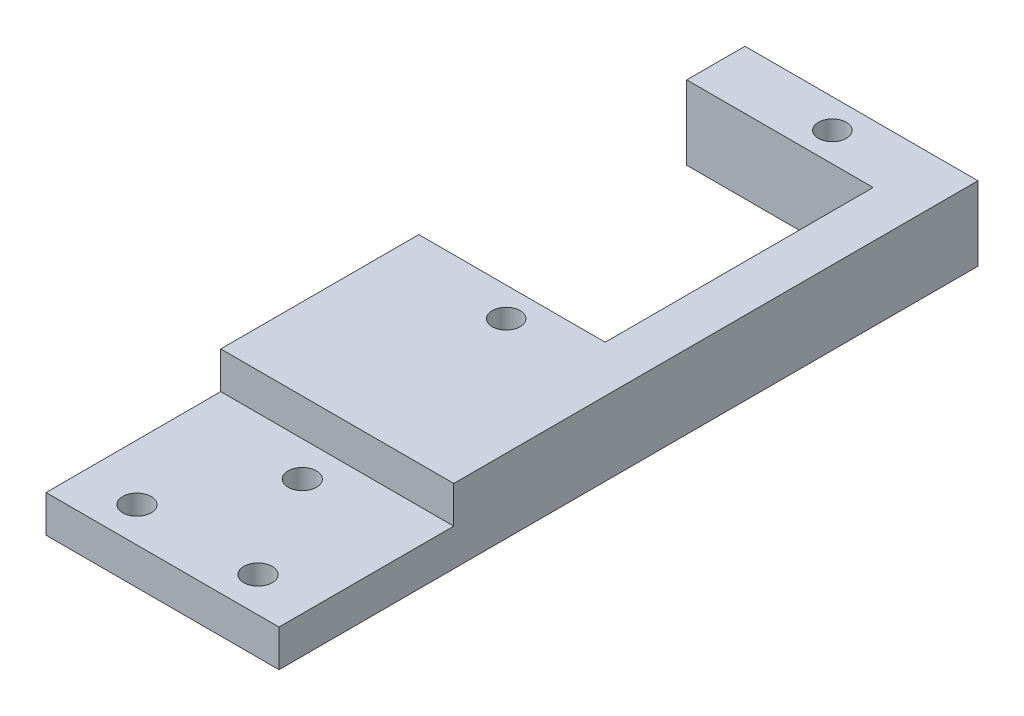
ISO-10303-21;
HEADER;
FILE_DESCRIPTION(('STEP AP214'),'2;1');
FILE_NAME('part.step','',(''),(''),'','','');
FILE_SCHEMA(('AUTOMOTIVE_DESIGN { 1 0 10303 214 1 1 1 1 }'));
ENDSEC;
DATA;
#1=APPLICATION_CONTEXT('core data for automotive mechanical design processes');
#2=APPLICATION_PROTOCOL_DEFINITION('international standard','automotive_design',2000,#1);
#3=PRODUCT_CONTEXT('',#1,'mechanical');
#4=PRODUCT('Part','Part','',(#3));
#5=PRODUCT_RELATED_PRODUCT_CATEGORY('part','',(#4));
#6=PRODUCT_DEFINITION_FORMATION('','',#4);
#7=PRODUCT_DEFINITION_CONTEXT('part definition',#1,'design');
#8=PRODUCT_DEFINITION('design','',#6,#7);
#9=PRODUCT_DEFINITION_SHAPE('','',#8);
#10=(LENGTH_UNIT() NAMED_UNIT(*) SI_UNIT(.MILLI.,.METRE.));
#11=(NAMED_UNIT(*) PLANE_ANGLE_UNIT() SI_UNIT($,.RADIAN.));
#12=(NAMED_UNIT(*) SI_UNIT($,.STERADIAN.) SOLID_ANGLE_UNIT());
#13=UNCERTAINTY_MEASURE_WITH_UNIT(LENGTH_MEASURE(1.E-05),#10,'distance_accuracy_value','');
#14=(GEOMETRIC_REPRESENTATION_CONTEXT(3) GLOBAL_UNCERTAINTY_ASSIGNED_CONTEXT((#13)) GLOBAL_UNIT_ASSIGNED_CONTEXT((#10,
#11,#12)) REPRESENTATION_CONTEXT('',''));
#15=CARTESIAN_POINT('',(0.,0.,0.));
#16=DIRECTION('',(0.,0.,1.));
#17=DIRECTION('',(1.,0.,0.));
#18=AXIS2_PLACEMENT_3D('',#15,#16,#17);
#19=CARTESIAN_POINT('',(0.,6.35,0.));
#20=DIRECTION('',(1.,0.,0.));
#21=DIRECTION('',(0.,0.,-1.));
#22=AXIS2_PLACEMENT_3D('',#19,#20,#21);
#23=PLANE('',#22);
#24=DIRECTION('',(0.,0.,1.));
#25=VECTOR('',#24,1.);
#26=CARTESIAN_POINT('',(0.,0.,0.));
#27=LINE('',#26,#25);
#28=CARTESIAN_POINT('',(0.,0.,0.));
#29=VERTEX_POINT('',#28);
#30=CARTESIAN_POINT('',(0.,0.,5.));
#31=VERTEX_POINT('',#30);
#32=EDGE_CURVE('E151',#29,#31,#27,.T.);
#33=ORIENTED_EDGE('',*,*,#32,.T.);
#34=DIRECTION('',(0.,1.,0.));
#35=VECTOR('',#34,1.);
#36=CARTESIAN_POINT('',(0.,0.,5.));
#37=LINE('',#36,#35);
#38=CARTESIAN_POINT('',(0.,6.35,5.));
#39=VERTEX_POINT('',#38);
#40=EDGE_CURVE('E152',#31,#39,#37,.T.);
#41=ORIENTED_EDGE('',*,*,#40,.T.);
#42=DIRECTION('',(0.,0.,1.));
#43=VECTOR('',#42,1.);
#44=CARTESIAN_POINT('',(0.,6.35,0.));
#45=LINE('',#44,#43);
#46=CARTESIAN_POINT('',(0.,6.35,0.));
#47=VERTEX_POINT('',#46);
#48=EDGE_CURVE('E248',#47,#39,#45,.T.);
#49=ORIENTED_EDGE('',*,*,#48,.F.);
#50=DIRECTION('',(0.,-1.,0.));
#51=VECTOR('',#50,1.);
#52=CARTESIAN_POINT('',(0.,6.35,0.));
#53=LINE('',#52,#51);
#54=EDGE_CURVE('E171',#47,#29,#53,.T.);
#55=ORIENTED_EDGE('',*,*,#54,.T.);
#56=EDGE_LOOP('',(#33,#41,#49,#55));
#57=FACE_BOUND('',#56,.T.);
#58=ADVANCED_FACE('F39',(#57),#23,.F.);
#59=DIRECTION('',(0.,0.,-1.));
#60=VECTOR('',#59,1.);
#61=CARTESIAN_POINT('',(0.,3.175,60.));
#62=LINE('',#61,#60);
#63=CARTESIAN_POINT('',(0.,3.175,60.));
#64=VERTEX_POINT('',#63);
#65=CARTESIAN_POINT('',(0.,3.175,45.));
#66=VERTEX_POINT('',#65);
#67=EDGE_CURVE('E121',#64,#66,#62,.T.);
#68=ORIENTED_EDGE('',*,*,#67,.T.);
#69=DIRECTION('',(0.,1.,0.));
#70=VECTOR('',#69,1.);
#71=CARTESIAN_POINT('',(0.,6.35,45.));
#72=LINE('',#71,#70);
#73=CARTESIAN_POINT('',(0.,6.35,45.));
#74=VERTEX_POINT('',#73);
#75=EDGE_CURVE('E133',#66,#74,#72,.T.);
#76=ORIENTED_EDGE('',*,*,#75,.T.);
#77=CARTESIAN_POINT('',(0.,6.35,28.));
#78=VERTEX_POINT('',#77);
#79=EDGE_CURVE('E170',#78,#74,#45,.T.);
#80=ORIENTED_EDGE('',*,*,#79,.F.);
#81=DIRECTION('',(0.,1.,0.));
#82=VECTOR('',#81,1.);
#83=CARTESIAN_POINT('',(0.,0.,28.));
#84=LINE('',#83,#82);
#85=CARTESIAN_POINT('',(0.,0.,28.));
#86=VERTEX_POINT('',#85);
#87=EDGE_CURVE('E147',#86,#78,#84,.T.);
#88=ORIENTED_EDGE('',*,*,#87,.F.);
#89=CARTESIAN_POINT('',(0.,0.,60.));
#90=VERTEX_POINT('',#89);
#91=EDGE_CURVE('E144',#86,#90,#27,.T.);
#92=ORIENTED_EDGE('',*,*,#91,.T.);
#93=DIRECTION('',(0.,-1.,0.));
#94=VECTOR('',#93,1.);
#95=CARTESIAN_POINT('',(0.,6.35,60.));
#96=LINE('',#95,#94);
#97=EDGE_CURVE('E11',#64,#90,#96,.T.);
#98=ORIENTED_EDGE('',*,*,#97,.F.);
#99=EDGE_LOOP('',(#68,#76,#80,#88,#92,#98));
#100=FACE_BOUND('',#99,.T.);
#101=ADVANCED_FACE('F41',(#100),#23,.F.);
#102=CARTESIAN_POINT('',(0.,6.35,60.));
#103=DIRECTION('',(0.,0.,-1.));
#104=DIRECTION('',(-1.,0.,0.));
#105=AXIS2_PLACEMENT_3D('',#102,#103,#104);
#106=PLANE('',#105);
#107=DIRECTION('',(0.,-1.,0.));
#108=VECTOR('',#107,1.);
#109=CARTESIAN_POINT('',(20.,6.35,60.));
#110=LINE('',#109,#108);
#111=CARTESIAN_POINT('',(20.,3.175,60.));
#112=VERTEX_POINT('',#111);
#113=CARTESIAN_POINT('',(20.,0.,60.));
#114=VERTEX_POINT('',#113);
#115=EDGE_CURVE('E48',#112,#114,#110,.T.);
#116=ORIENTED_EDGE('',*,*,#115,.F.);
#117=DIRECTION('',(1.,0.,0.));
#118=VECTOR('',#117,1.);
#119=CARTESIAN_POINT('',(0.,3.175,60.));
#120=LINE('',#119,#118);
#121=EDGE_CURVE('E125',#64,#112,#120,.T.);
#122=ORIENTED_EDGE('',*,*,#121,.F.);
#123=ORIENTED_EDGE('',*,*,#97,.T.);
#124=DIRECTION('',(1.,0.,0.));
#125=VECTOR('',#124,1.);
#126=CARTESIAN_POINT('',(0.,0.,60.));
#127=LINE('',#126,#125);
#128=EDGE_CURVE('E155',#90,#114,#127,.T.);
#129=ORIENTED_EDGE('',*,*,#128,.T.);
#130=EDGE_LOOP('',(#116,#122,#123,#129));
#131=FACE_BOUND('',#130,.T.);
#132=ADVANCED_FACE('F137',(#131),#106,.F.);
#133=CARTESIAN_POINT('',(20.,6.35,0.));
#134=DIRECTION('',(-1.,0.,0.));
#135=DIRECTION('',(0.,0.,1.));
#136=AXIS2_PLACEMENT_3D('',#133,#134,#135);
#137=PLANE('',#136);
#138=DIRECTION('',(0.,0.,-1.));
#139=VECTOR('',#138,1.);
#140=CARTESIAN_POINT('',(20.,6.35,0.));
#141=LINE('',#140,#139);
#142=CARTESIAN_POINT('',(20.,6.35,45.));
#143=VERTEX_POINT('',#142);
#144=CARTESIAN_POINT('',(20.,6.35,0.));
#145=VERTEX_POINT('',#144);
#146=EDGE_CURVE('E252',#143,#145,#141,.T.);
#147=ORIENTED_EDGE('',*,*,#146,.F.);
#148=DIRECTION('',(0.,1.,0.));
#149=VECTOR('',#148,1.);
#150=CARTESIAN_POINT('',(20.,6.35,45.));
#151=LINE('',#150,#149);
#152=CARTESIAN_POINT('',(20.,3.175,45.));
#153=VERTEX_POINT('',#152);
#154=EDGE_CURVE('E55',#153,#143,#151,.T.);
#155=ORIENTED_EDGE('',*,*,#154,.F.);
#156=DIRECTION('',(0.,0.,-1.));
#157=VECTOR('',#156,1.);
#158=CARTESIAN_POINT('',(20.,3.175,60.));
#159=LINE('',#158,#157);
#160=EDGE_CURVE('E184',#112,#153,#159,.T.);
#161=ORIENTED_EDGE('',*,*,#160,.F.);
#162=ORIENTED_EDGE('',*,*,#115,.T.);
#163=DIRECTION('',(0.,0.,-1.));
#164=VECTOR('',#163,1.);
#165=CARTESIAN_POINT('',(20.,0.,0.));
#166=LINE('',#165,#164);
#167=CARTESIAN_POINT('',(20.,0.,0.));
#168=VERTEX_POINT('',#167);
#169=EDGE_CURVE('E158',#114,#168,#166,.T.);
#170=ORIENTED_EDGE('',*,*,#169,.T.);
#171=DIRECTION('',(0.,-1.,0.));
#172=VECTOR('',#171,1.);
#173=CARTESIAN_POINT('',(20.,6.35,0.));
#174=LINE('',#173,#172);
#175=EDGE_CURVE('E175',#145,#168,#174,.T.);
#176=ORIENTED_EDGE('',*,*,#175,.F.);
#177=EDGE_LOOP('',(#147,#155,#161,#162,#170,#176));
#178=FACE_BOUND('',#177,.T.);
#179=ADVANCED_FACE('F182',(#178),#137,.F.);
#180=CARTESIAN_POINT('',(0.,6.35,0.));
#181=DIRECTION('',(0.,0.,1.));
#182=DIRECTION('',(1.,0.,0.));
#183=AXIS2_PLACEMENT_3D('',#180,#181,#182);
#184=PLANE('',#183);
#185=DIRECTION('',(-1.,0.,0.));
#186=VECTOR('',#185,1.);
#187=CARTESIAN_POINT('',(0.,0.,0.));
#188=LINE('',#187,#186);
#189=EDGE_CURVE('E163',#168,#29,#188,.T.);
#190=ORIENTED_EDGE('',*,*,#189,.T.);
#191=ORIENTED_EDGE('',*,*,#54,.F.);
#192=DIRECTION('',(-1.,0.,0.));
#193=VECTOR('',#192,1.);
#194=CARTESIAN_POINT('',(0.,6.35,0.));
#195=LINE('',#194,#193);
#196=EDGE_CURVE('E176',#145,#47,#195,.T.);
#197=ORIENTED_EDGE('',*,*,#196,.F.);
#198=ORIENTED_EDGE('',*,*,#175,.T.);
#199=EDGE_LOOP('',(#190,#191,#197,#198));
#200=FACE_BOUND('',#199,.T.);
#201=ADVANCED_FACE('F263',(#200),#184,.F.);
#202=CARTESIAN_POINT('',(0.,6.35,0.));
#203=DIRECTION('',(0.,1.,0.));
#204=DIRECTION('',(0.,0.,1.));
#205=AXIS2_PLACEMENT_3D('',#202,#203,#204);
#206=PLANE('',#205);
#207=DIRECTION('',(1.,0.,0.));
#208=VECTOR('',#207,1.);
#209=CARTESIAN_POINT('',(0.,6.35,45.));
#210=LINE('',#209,#208);
#211=EDGE_CURVE('E196',#74,#143,#210,.T.);
#212=ORIENTED_EDGE('',*,*,#211,.T.);
#213=ORIENTED_EDGE('',*,*,#146,.T.);
#214=ORIENTED_EDGE('',*,*,#196,.T.);
#215=ORIENTED_EDGE('',*,*,#48,.T.);
#216=DIRECTION('',(-1.,0.,0.));
#217=VECTOR('',#216,1.);
#218=CARTESIAN_POINT('',(0.,6.35,5.));
#219=LINE('',#218,#217);
#220=CARTESIAN_POINT('',(16.,6.35,5.));
#221=VERTEX_POINT('',#220);
#222=EDGE_CURVE('E221',#221,#39,#219,.T.);
#223=ORIENTED_EDGE('',*,*,#222,.F.);
#224=DIRECTION('',(0.,0.,-1.));
#225=VECTOR('',#224,1.);
#226=CARTESIAN_POINT('',(16.,6.35,5.));
#227=LINE('',#226,#225);
#228=CARTESIAN_POINT('',(16.,6.35,28.));
#229=VERTEX_POINT('',#228);
#230=EDGE_CURVE('E231',#229,#221,#227,.T.);
#231=ORIENTED_EDGE('',*,*,#230,.F.);
#232=DIRECTION('',(1.,0.,0.));
#233=VECTOR('',#232,1.);
#234=CARTESIAN_POINT('',(0.,6.35,28.));
#235=LINE('',#234,#233);
#236=EDGE_CURVE('E217',#78,#229,#235,.T.);
#237=ORIENTED_EDGE('',*,*,#236,.F.);
#238=ORIENTED_EDGE('',*,*,#79,.T.);
#239=EDGE_LOOP('',(#212,#213,#214,#215,#223,#231,#237,#238));
#240=FACE_BOUND('',#239,.T.);
#241=CARTESIAN_POINT('',(10.,6.35,2.5));
#242=DIRECTION('',(0.,1.,0.));
#243=DIRECTION('',(0.,0.,1.));
#244=AXIS2_PLACEMENT_3D('',#241,#242,#243);
#245=CIRCLE('',#244,1.19999999999999);
#246=CARTESIAN_POINT('',(10.,6.35,3.69999999999999));
#247=VERTEX_POINT('',#246);
#248=EDGE_CURVE('E199',#247,#247,#245,.T.);
#249=ORIENTED_EDGE('',*,*,#248,.F.);
#250=EDGE_LOOP('',(#249));
#251=FACE_BOUND('',#250,.T.);
#252=CARTESIAN_POINT('',(10.,6.35,30.5));
#253=DIRECTION('',(0.,1.,0.));
#254=DIRECTION('',(0.,0.,1.));
#255=AXIS2_PLACEMENT_3D('',#252,#253,#254);
#256=CIRCLE('',#255,1.19999999999999);
#257=CARTESIAN_POINT('',(10.,6.35,31.7));
#258=VERTEX_POINT('',#257);
#259=EDGE_CURVE('E209',#258,#258,#256,.T.);
#260=ORIENTED_EDGE('',*,*,#259,.F.);
#261=EDGE_LOOP('',(#260));
#262=FACE_BOUND('',#261,.T.);
#263=ADVANCED_FACE('F258',(#240,#251,#262),#206,.T.);
#264=CARTESIAN_POINT('',(0.,0.,0.));
#265=DIRECTION('',(0.,1.,0.));
#266=DIRECTION('',(0.,0.,1.));
#267=AXIS2_PLACEMENT_3D('',#264,#265,#266);
#268=PLANE('',#267);
#269=CARTESIAN_POINT('',(10.,0.,48.));
#270=DIRECTION('',(0.,1.,0.));
#271=DIRECTION('',(0.,0.,1.));
#272=AXIS2_PLACEMENT_3D('',#269,#270,#271);
#273=CIRCLE('',#272,1.2192);
#274=CARTESIAN_POINT('',(10.,0.,49.2192));
#275=VERTEX_POINT('',#274);
#276=EDGE_CURVE('E415',#275,#275,#273,.T.);
#277=ORIENTED_EDGE('',*,*,#276,.T.);
#278=EDGE_LOOP('',(#277));
#279=FACE_BOUND('',#278,.T.);
#280=CARTESIAN_POINT('',(4.80384757729337,0.,57.));
#281=DIRECTION('',(0.,1.,0.));
#282=DIRECTION('',(0.,0.,1.));
#283=AXIS2_PLACEMENT_3D('',#280,#281,#282);
#284=CIRCLE('',#283,1.2192);
#285=CARTESIAN_POINT('',(4.80384757729337,0.,58.2192));
#286=VERTEX_POINT('',#285);
#287=EDGE_CURVE('E428',#286,#286,#284,.T.);
#288=ORIENTED_EDGE('',*,*,#287,.T.);
#289=EDGE_LOOP('',(#288));
#290=FACE_BOUND('',#289,.T.);
#291=CARTESIAN_POINT('',(15.1961524227066,0.,57.));
#292=DIRECTION('',(0.,1.,0.));
#293=DIRECTION('',(0.,0.,1.));
#294=AXIS2_PLACEMENT_3D('',#291,#292,#293);
#295=CIRCLE('',#294,1.2192);
#296=CARTESIAN_POINT('',(15.1961524227066,0.,58.2192));
#297=VERTEX_POINT('',#296);
#298=EDGE_CURVE('E186',#297,#297,#295,.T.);
#299=ORIENTED_EDGE('',*,*,#298,.T.);
#300=EDGE_LOOP('',(#299));
#301=FACE_BOUND('',#300,.T.);
#302=DIRECTION('',(0.,0.,-1.));
#303=VECTOR('',#302,1.);
#304=CARTESIAN_POINT('',(16.,0.,5.));
#305=LINE('',#304,#303);
#306=CARTESIAN_POINT('',(16.,0.,28.));
#307=VERTEX_POINT('',#306);
#308=CARTESIAN_POINT('',(16.,0.,5.));
#309=VERTEX_POINT('',#308);
#310=EDGE_CURVE('E63',#307,#309,#305,.T.);
#311=ORIENTED_EDGE('',*,*,#310,.T.);
#312=DIRECTION('',(-1.,0.,0.));
#313=VECTOR('',#312,1.);
#314=CARTESIAN_POINT('',(0.,0.,5.));
#315=LINE('',#314,#313);
#316=EDGE_CURVE('E224',#309,#31,#315,.T.);
#317=ORIENTED_EDGE('',*,*,#316,.T.);
#318=ORIENTED_EDGE('',*,*,#32,.F.);
#319=ORIENTED_EDGE('',*,*,#189,.F.);
#320=ORIENTED_EDGE('',*,*,#169,.F.);
#321=ORIENTED_EDGE('',*,*,#128,.F.);
#322=ORIENTED_EDGE('',*,*,#91,.F.);
#323=DIRECTION('',(1.,0.,0.));
#324=VECTOR('',#323,1.);
#325=CARTESIAN_POINT('',(0.,0.,28.));
#326=LINE('',#325,#324);
#327=EDGE_CURVE('E218',#86,#307,#326,.T.);
#328=ORIENTED_EDGE('',*,*,#327,.T.);
#329=EDGE_LOOP('',(#311,#317,#318,#319,#320,#321,#322,#328));
#330=FACE_BOUND('',#329,.T.);
#331=ADVANCED_FACE('F156',(#279,#290,#301,#330),#268,.F.);
#332=CARTESIAN_POINT('',(0.,0.,5.));
#333=DIRECTION('',(0.,0.,-1.));
#334=DIRECTION('',(-1.,0.,0.));
#335=AXIS2_PLACEMENT_3D('',#332,#333,#334);
#336=PLANE('',#335);
#337=ORIENTED_EDGE('',*,*,#222,.T.);
#338=ORIENTED_EDGE('',*,*,#40,.F.);
#339=ORIENTED_EDGE('',*,*,#316,.F.);
#340=DIRECTION('',(0.,1.,0.));
#341=VECTOR('',#340,1.);
#342=CARTESIAN_POINT('',(16.,0.,5.));
#343=LINE('',#342,#341);
#344=EDGE_CURVE('E240',#309,#221,#343,.T.);
#345=ORIENTED_EDGE('',*,*,#344,.T.);
#346=EDGE_LOOP('',(#337,#338,#339,#345));
#347=FACE_BOUND('',#346,.T.);
#348=ADVANCED_FACE('F268',(#347),#336,.F.);
#349=CARTESIAN_POINT('',(16.,0.,5.));
#350=DIRECTION('',(1.,0.,0.));
#351=DIRECTION('',(0.,0.,-1.));
#352=AXIS2_PLACEMENT_3D('',#349,#350,#351);
#353=PLANE('',#352);
#354=ORIENTED_EDGE('',*,*,#230,.T.);
#355=ORIENTED_EDGE('',*,*,#344,.F.);
#356=ORIENTED_EDGE('',*,*,#310,.F.);
#357=DIRECTION('',(0.,1.,0.));
#358=VECTOR('',#357,1.);
#359=CARTESIAN_POINT('',(16.,0.,28.));
#360=LINE('',#359,#358);
#361=EDGE_CURVE('E243',#307,#229,#360,.T.);
#362=ORIENTED_EDGE('',*,*,#361,.T.);
#363=EDGE_LOOP('',(#354,#355,#356,#362));
#364=FACE_BOUND('',#363,.T.);
#365=ADVANCED_FACE('F273',(#364),#353,.F.);
#366=CARTESIAN_POINT('',(0.,0.,28.));
#367=DIRECTION('',(0.,0.,1.));
#368=DIRECTION('',(1.,0.,0.));
#369=AXIS2_PLACEMENT_3D('',#366,#367,#368);
#370=PLANE('',#369);
#371=ORIENTED_EDGE('',*,*,#236,.T.);
#372=ORIENTED_EDGE('',*,*,#361,.F.);
#373=ORIENTED_EDGE('',*,*,#327,.F.);
#374=ORIENTED_EDGE('',*,*,#87,.T.);
#375=EDGE_LOOP('',(#371,#372,#373,#374));
#376=FACE_BOUND('',#375,.T.);
#377=ADVANCED_FACE('F270',(#376),#370,.F.);
#378=CARTESIAN_POINT('',(10.,1.35,30.5));
#379=DIRECTION('',(0.,1.,0.));
#380=DIRECTION('',(0.,0.,1.));
#381=AXIS2_PLACEMENT_3D('',#378,#379,#380);
#382=CONICAL_SURFACE('',#381,1.19999999999999,1.02974425867665);
#383=CARTESIAN_POINT('',(10.,0.628967257166926,30.5));
#384=VERTEX_POINT('',#383);
#385=VERTEX_LOOP('',#384);
#386=FACE_BOUND('',#385,.T.);
#387=CARTESIAN_POINT('',(10.,1.35,30.5));
#388=DIRECTION('',(0.,1.,0.));
#389=DIRECTION('',(0.,0.,1.));
#390=AXIS2_PLACEMENT_3D('',#387,#388,#389);
#391=CIRCLE('',#390,1.19999999999999);
#392=CARTESIAN_POINT('',(10.,1.35,31.7));
#393=VERTEX_POINT('',#392);
#394=EDGE_CURVE('E213',#393,#393,#391,.T.);
#395=ORIENTED_EDGE('',*,*,#394,.T.);
#396=EDGE_LOOP('',(#395));
#397=FACE_BOUND('',#396,.T.);
#398=ADVANCED_FACE('F313',(#386,#397),#382,.F.);
#399=CARTESIAN_POINT('',(10.,6.35,30.5));
#400=DIRECTION('',(0.,1.,0.));
#401=DIRECTION('',(0.,0.,1.));
#402=AXIS2_PLACEMENT_3D('',#399,#400,#401);
#403=CYLINDRICAL_SURFACE('',#402,1.19999999999999);
#404=ORIENTED_EDGE('',*,*,#394,.F.);
#405=EDGE_LOOP('',(#404));
#406=FACE_BOUND('',#405,.T.);
#407=ORIENTED_EDGE('',*,*,#259,.T.);
#408=EDGE_LOOP('',(#407));
#409=FACE_BOUND('',#408,.T.);
#410=ADVANCED_FACE('F320',(#406,#409),#403,.F.);
#411=CARTESIAN_POINT('',(10.,1.35,2.5));
#412=DIRECTION('',(0.,1.,0.));
#413=DIRECTION('',(0.,0.,1.));
#414=AXIS2_PLACEMENT_3D('',#411,#412,#413);
#415=CONICAL_SURFACE('',#414,1.19999999999999,1.02974425867665);
#416=CARTESIAN_POINT('',(10.,0.628967257166926,2.5));
#417=VERTEX_POINT('',#416);
#418=VERTEX_LOOP('',#417);
#419=FACE_BOUND('',#418,.T.);
#420=CARTESIAN_POINT('',(10.,1.35,2.5));
#421=DIRECTION('',(0.,1.,0.));
#422=DIRECTION('',(0.,0.,1.));
#423=AXIS2_PLACEMENT_3D('',#420,#421,#422);
#424=CIRCLE('',#423,1.19999999999999);
#425=CARTESIAN_POINT('',(10.,1.35,3.69999999999999));
#426=VERTEX_POINT('',#425);
#427=EDGE_CURVE('E205',#426,#426,#424,.T.);
#428=ORIENTED_EDGE('',*,*,#427,.T.);
#429=EDGE_LOOP('',(#428));
#430=FACE_BOUND('',#429,.T.);
#431=ADVANCED_FACE('F288',(#419,#430),#415,.F.);
#432=CARTESIAN_POINT('',(10.,6.35,2.5));
#433=DIRECTION('',(0.,1.,0.));
#434=DIRECTION('',(0.,0.,1.));
#435=AXIS2_PLACEMENT_3D('',#432,#433,#434);
#436=CYLINDRICAL_SURFACE('',#435,1.19999999999999);
#437=ORIENTED_EDGE('',*,*,#427,.F.);
#438=EDGE_LOOP('',(#437));
#439=FACE_BOUND('',#438,.T.);
#440=ORIENTED_EDGE('',*,*,#248,.T.);
#441=EDGE_LOOP('',(#440));
#442=FACE_BOUND('',#441,.T.);
#443=ADVANCED_FACE('F279',(#439,#442),#436,.F.);
#444=CARTESIAN_POINT('',(0.,6.35,45.));
#445=DIRECTION('',(0.,0.,-1.));
#446=DIRECTION('',(-1.,0.,0.));
#447=AXIS2_PLACEMENT_3D('',#444,#445,#446);
#448=PLANE('',#447);
#449=ORIENTED_EDGE('',*,*,#154,.T.);
#450=ORIENTED_EDGE('',*,*,#211,.F.);
#451=ORIENTED_EDGE('',*,*,#75,.F.);
#452=DIRECTION('',(1.,0.,0.));
#453=VECTOR('',#452,1.);
#454=CARTESIAN_POINT('',(0.,3.175,45.));
#455=LINE('',#454,#453);
#456=EDGE_CURVE('E127',#66,#153,#455,.T.);
#457=ORIENTED_EDGE('',*,*,#456,.T.);
#458=EDGE_LOOP('',(#449,#450,#451,#457));
#459=FACE_BOUND('',#458,.T.);
#460=ADVANCED_FACE('F277',(#459),#448,.F.);
#461=CARTESIAN_POINT('',(0.,3.175,60.));
#462=DIRECTION('',(0.,-1.,0.));
#463=DIRECTION('',(0.,0.,-1.));
#464=AXIS2_PLACEMENT_3D('',#461,#462,#463);
#465=PLANE('',#464);
#466=CARTESIAN_POINT('',(10.,3.175,48.));
#467=DIRECTION('',(0.,1.,0.));
#468=DIRECTION('',(0.,0.,1.));
#469=AXIS2_PLACEMENT_3D('',#466,#467,#468);
#470=CIRCLE('',#469,1.21919999999999);
#471=CARTESIAN_POINT('',(10.,3.175,49.2192));
#472=VERTEX_POINT('',#471);
#473=EDGE_CURVE('E418',#472,#472,#470,.T.);
#474=ORIENTED_EDGE('',*,*,#473,.F.);
#475=EDGE_LOOP('',(#474));
#476=FACE_BOUND('',#475,.T.);
#477=CARTESIAN_POINT('',(4.80384757729337,3.175,57.));
#478=DIRECTION('',(0.,1.,0.));
#479=DIRECTION('',(0.,0.,1.));
#480=AXIS2_PLACEMENT_3D('',#477,#478,#479);
#481=CIRCLE('',#480,1.21919999999999);
#482=CARTESIAN_POINT('',(4.80384757729337,3.175,58.2192));
#483=VERTEX_POINT('',#482);
#484=EDGE_CURVE('E422',#483,#483,#481,.T.);
#485=ORIENTED_EDGE('',*,*,#484,.F.);
#486=EDGE_LOOP('',(#485));
#487=FACE_BOUND('',#486,.T.);
#488=CARTESIAN_POINT('',(15.1961524227066,3.175,57.));
#489=DIRECTION('',(0.,1.,0.));
#490=DIRECTION('',(0.,0.,1.));
#491=AXIS2_PLACEMENT_3D('',#488,#489,#490);
#492=CIRCLE('',#491,1.21919999999999);
#493=CARTESIAN_POINT('',(15.1961524227066,3.175,58.2192));
#494=VERTEX_POINT('',#493);
#495=EDGE_CURVE('E192',#494,#494,#492,.T.);
#496=ORIENTED_EDGE('',*,*,#495,.F.);
#497=EDGE_LOOP('',(#496));
#498=FACE_BOUND('',#497,.T.);
#499=ORIENTED_EDGE('',*,*,#160,.T.);
#500=ORIENTED_EDGE('',*,*,#456,.F.);
#501=ORIENTED_EDGE('',*,*,#67,.F.);
#502=ORIENTED_EDGE('',*,*,#121,.T.);
#503=EDGE_LOOP('',(#499,#500,#501,#502));
#504=FACE_BOUND('',#503,.T.);
#505=ADVANCED_FACE('F124',(#476,#487,#498,#504),#465,.F.);
#506=CARTESIAN_POINT('',(15.1961524227066,3.175,57.));
#507=DIRECTION('',(0.,1.,0.));
#508=DIRECTION('',(0.,0.,1.));
#509=AXIS2_PLACEMENT_3D('',#506,#507,#508);
#510=CYLINDRICAL_SURFACE('',#509,1.21919999999999);
#511=ORIENTED_EDGE('',*,*,#298,.F.);
#512=EDGE_LOOP('',(#511));
#513=FACE_BOUND('',#512,.T.);
#514=ORIENTED_EDGE('',*,*,#495,.T.);
#515=EDGE_LOOP('',(#514));
#516=FACE_BOUND('',#515,.T.);
#517=ADVANCED_FACE('F285',(#513,#516),#510,.F.);
#518=CARTESIAN_POINT('',(4.80384757729337,3.175,57.));
#519=DIRECTION('',(0.,1.,0.));
#520=DIRECTION('',(0.,0.,1.));
#521=AXIS2_PLACEMENT_3D('',#518,#519,#520);
#522=CYLINDRICAL_SURFACE('',#521,1.21919999999999);
#523=ORIENTED_EDGE('',*,*,#287,.F.);
#524=EDGE_LOOP('',(#523));
#525=FACE_BOUND('',#524,.T.);
#526=ORIENTED_EDGE('',*,*,#484,.T.);
#527=EDGE_LOOP('',(#526));
#528=FACE_BOUND('',#527,.T.);
#529=ADVANCED_FACE('F389',(#525,#528),#522,.F.);
#530=CARTESIAN_POINT('',(10.,3.175,48.));
#531=DIRECTION('',(0.,1.,0.));
#532=DIRECTION('',(0.,0.,1.));
#533=AXIS2_PLACEMENT_3D('',#530,#531,#532);
#534=CYLINDRICAL_SURFACE('',#533,1.21919999999999);
#535=ORIENTED_EDGE('',*,*,#276,.F.);
#536=EDGE_LOOP('',(#535));
#537=FACE_BOUND('',#536,.T.);
#538=ORIENTED_EDGE('',*,*,#473,.T.);
#539=EDGE_LOOP('',(#538));
#540=FACE_BOUND('',#539,.T.);
#541=ADVANCED_FACE('F398',(#537,#540),#534,.F.);
#542=CLOSED_SHELL('',(#58,#101,#132,#179,#201,#263,#331,#348,#365,#377,#398,#410,#431,#443,#460,
#505,#517,#529,#541));
#543=MANIFOLD_SOLID_BREP('B2',#542);
#544=ADVANCED_BREP_SHAPE_REPRESENTATION('',(#18,#543),#14);
#545=SHAPE_DEFINITION_REPRESENTATION(#9,#544);
ENDSEC;
END-ISO-10303-21;
